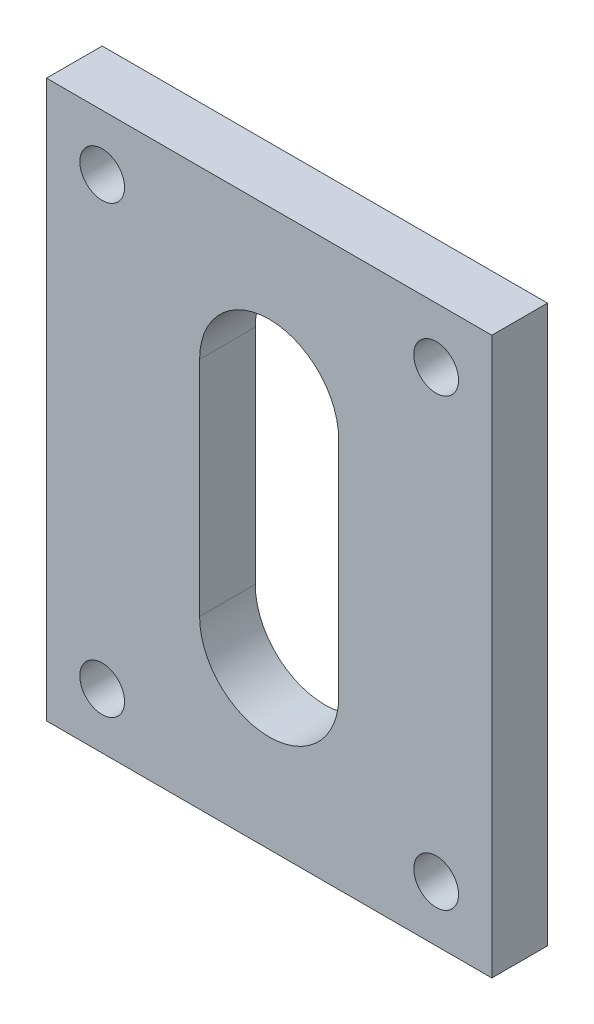
ISO-10303-21;
HEADER;
FILE_DESCRIPTION(('STEP AP214'),'2;1');
FILE_NAME('part.step','',(''),(''),'','','');
FILE_SCHEMA(('AUTOMOTIVE_DESIGN { 1 0 10303 214 1 1 1 1 }'));
ENDSEC;
DATA;
#1=APPLICATION_CONTEXT('core data for automotive mechanical design processes');
#2=APPLICATION_PROTOCOL_DEFINITION('international standard','automotive_design',2000,#1);
#3=PRODUCT_CONTEXT('',#1,'mechanical');
#4=PRODUCT('Part','Part','',(#3));
#5=PRODUCT_RELATED_PRODUCT_CATEGORY('part','',(#4));
#6=PRODUCT_DEFINITION_FORMATION('','',#4);
#7=PRODUCT_DEFINITION_CONTEXT('part definition',#1,'design');
#8=PRODUCT_DEFINITION('design','',#6,#7);
#9=PRODUCT_DEFINITION_SHAPE('','',#8);
#10=(LENGTH_UNIT() NAMED_UNIT(*) SI_UNIT(.MILLI.,.METRE.));
#11=(NAMED_UNIT(*) PLANE_ANGLE_UNIT() SI_UNIT($,.RADIAN.));
#12=(NAMED_UNIT(*) SI_UNIT($,.STERADIAN.) SOLID_ANGLE_UNIT());
#13=UNCERTAINTY_MEASURE_WITH_UNIT(LENGTH_MEASURE(1.E-05),#10,'distance_accuracy_value','');
#14=(GEOMETRIC_REPRESENTATION_CONTEXT(3) GLOBAL_UNCERTAINTY_ASSIGNED_CONTEXT((#13)) GLOBAL_UNIT_ASSIGNED_CONTEXT((#10,
#11,#12)) REPRESENTATION_CONTEXT('',''));
#15=CARTESIAN_POINT('',(0.,0.,0.));
#16=DIRECTION('',(0.,0.,1.));
#17=DIRECTION('',(1.,0.,0.));
#18=AXIS2_PLACEMENT_3D('',#15,#16,#17);
#19=CARTESIAN_POINT('',(0.,0.,6.35));
#20=DIRECTION('',(0.,0.,-1.));
#21=DIRECTION('',(-1.,0.,0.));
#22=AXIS2_PLACEMENT_3D('',#19,#20,#21);
#23=PLANE('',#22);
#24=CARTESIAN_POINT('',(-19.05,-25.4,6.35));
#25=DIRECTION('',(0.,0.,1.));
#26=DIRECTION('',(-1.,0.,0.));
#27=AXIS2_PLACEMENT_3D('',#24,#25,#26);
#28=CIRCLE('',#27,2.5527);
#29=CARTESIAN_POINT('',(-21.6027,-25.4,6.35));
#30=VERTEX_POINT('',#29);
#31=EDGE_CURVE('E134',#30,#30,#28,.T.);
#32=ORIENTED_EDGE('',*,*,#31,.F.);
#33=EDGE_LOOP('',(#32));
#34=FACE_BOUND('',#33,.T.);
#35=CARTESIAN_POINT('',(19.05,25.4,6.35));
#36=DIRECTION('',(0.,0.,1.));
#37=DIRECTION('',(1.,0.,0.));
#38=AXIS2_PLACEMENT_3D('',#35,#36,#37);
#39=CIRCLE('',#38,2.5527);
#40=CARTESIAN_POINT('',(21.6027,25.4,6.35));
#41=VERTEX_POINT('',#40);
#42=EDGE_CURVE('E146',#41,#41,#39,.T.);
#43=ORIENTED_EDGE('',*,*,#42,.F.);
#44=EDGE_LOOP('',(#43));
#45=FACE_BOUND('',#44,.T.);
#46=DIRECTION('',(0.,1.,0.));
#47=VECTOR('',#46,1.);
#48=CARTESIAN_POINT('',(25.4,-31.75,6.35));
#49=LINE('',#48,#47);
#50=CARTESIAN_POINT('',(25.4,-31.75,6.35));
#51=VERTEX_POINT('',#50);
#52=CARTESIAN_POINT('',(25.4,31.75,6.35));
#53=VERTEX_POINT('',#52);
#54=EDGE_CURVE('E158',#51,#53,#49,.T.);
#55=ORIENTED_EDGE('',*,*,#54,.T.);
#56=DIRECTION('',(-1.,0.,0.));
#57=VECTOR('',#56,1.);
#58=CARTESIAN_POINT('',(-25.4,31.75,6.35));
#59=LINE('',#58,#57);
#60=CARTESIAN_POINT('',(-25.4,31.75,6.35));
#61=VERTEX_POINT('',#60);
#62=EDGE_CURVE('E161',#53,#61,#59,.T.);
#63=ORIENTED_EDGE('',*,*,#62,.T.);
#64=DIRECTION('',(0.,-1.,0.));
#65=VECTOR('',#64,1.);
#66=CARTESIAN_POINT('',(-25.4,-31.75,6.35));
#67=LINE('',#66,#65);
#68=CARTESIAN_POINT('',(-25.4,-31.75,6.35));
#69=VERTEX_POINT('',#68);
#70=EDGE_CURVE('E164',#61,#69,#67,.T.);
#71=ORIENTED_EDGE('',*,*,#70,.T.);
#72=DIRECTION('',(1.,0.,0.));
#73=VECTOR('',#72,1.);
#74=CARTESIAN_POINT('',(-25.4,-31.75,6.35));
#75=LINE('',#74,#73);
#76=EDGE_CURVE('E166',#69,#51,#75,.T.);
#77=ORIENTED_EDGE('',*,*,#76,.T.);
#78=EDGE_LOOP('',(#55,#63,#71,#77));
#79=FACE_BOUND('',#78,.T.);
#80=CARTESIAN_POINT('',(-19.05,25.4,6.35));
#81=DIRECTION('',(0.,0.,1.));
#82=DIRECTION('',(-1.,0.,0.));
#83=AXIS2_PLACEMENT_3D('',#80,#81,#82);
#84=CIRCLE('',#83,2.5527);
#85=CARTESIAN_POINT('',(-21.6027,25.4,6.35));
#86=VERTEX_POINT('',#85);
#87=EDGE_CURVE('E152',#86,#86,#84,.T.);
#88=ORIENTED_EDGE('',*,*,#87,.F.);
#89=EDGE_LOOP('',(#88));
#90=FACE_BOUND('',#89,.T.);
#91=CARTESIAN_POINT('',(19.05,-25.4,6.35));
#92=DIRECTION('',(0.,0.,1.));
#93=DIRECTION('',(1.,0.,0.));
#94=AXIS2_PLACEMENT_3D('',#91,#92,#93);
#95=CIRCLE('',#94,2.5527);
#96=CARTESIAN_POINT('',(21.6027,-25.4,6.35));
#97=VERTEX_POINT('',#96);
#98=EDGE_CURVE('E140',#97,#97,#95,.T.);
#99=ORIENTED_EDGE('',*,*,#98,.F.);
#100=EDGE_LOOP('',(#99));
#101=FACE_BOUND('',#100,.T.);
#102=CARTESIAN_POINT('',(0.,-12.7,6.35));
#103=DIRECTION('',(0.,0.,1.));
#104=DIRECTION('',(1.,0.,0.));
#105=AXIS2_PLACEMENT_3D('',#102,#103,#104);
#106=CIRCLE('',#105,7.9375);
#107=CARTESIAN_POINT('',(-7.9375,-12.7,6.35));
#108=VERTEX_POINT('',#107);
#109=CARTESIAN_POINT('',(7.9375,-12.7,6.35));
#110=VERTEX_POINT('',#109);
#111=EDGE_CURVE('E98',#108,#110,#106,.T.);
#112=ORIENTED_EDGE('',*,*,#111,.F.);
#113=DIRECTION('',(0.,-1.,0.));
#114=VECTOR('',#113,1.);
#115=CARTESIAN_POINT('',(-7.9375,-12.7,6.35));
#116=LINE('',#115,#114);
#117=CARTESIAN_POINT('',(-7.9375,12.7,6.35));
#118=VERTEX_POINT('',#117);
#119=EDGE_CURVE('E120',#118,#108,#116,.T.);
#120=ORIENTED_EDGE('',*,*,#119,.F.);
#121=CARTESIAN_POINT('',(0.,12.7,6.35));
#122=DIRECTION('',(0.,0.,1.));
#123=DIRECTION('',(1.,0.,0.));
#124=AXIS2_PLACEMENT_3D('',#121,#122,#123);
#125=CIRCLE('',#124,7.9375);
#126=CARTESIAN_POINT('',(7.93749999999999,12.7,6.35));
#127=VERTEX_POINT('',#126);
#128=EDGE_CURVE('E118',#127,#118,#125,.T.);
#129=ORIENTED_EDGE('',*,*,#128,.F.);
#130=DIRECTION('',(0.,1.,0.));
#131=VECTOR('',#130,1.);
#132=CARTESIAN_POINT('',(7.9375,-12.7,6.35));
#133=LINE('',#132,#131);
#134=EDGE_CURVE('E106',#110,#127,#133,.T.);
#135=ORIENTED_EDGE('',*,*,#134,.F.);
#136=EDGE_LOOP('',(#112,#120,#129,#135));
#137=FACE_BOUND('',#136,.T.);
#138=ADVANCED_FACE('F33',(#34,#45,#79,#90,#101,#137),#23,.F.);
#139=CARTESIAN_POINT('',(0.,0.,0.));
#140=DIRECTION('',(0.,0.,-1.));
#141=DIRECTION('',(-1.,0.,0.));
#142=AXIS2_PLACEMENT_3D('',#139,#140,#141);
#143=PLANE('',#142);
#144=CARTESIAN_POINT('',(-19.05,-25.4,0.));
#145=DIRECTION('',(0.,0.,1.));
#146=DIRECTION('',(-1.,0.,0.));
#147=AXIS2_PLACEMENT_3D('',#144,#145,#146);
#148=CIRCLE('',#147,2.5527);
#149=CARTESIAN_POINT('',(-21.6027,-25.4,0.));
#150=VERTEX_POINT('',#149);
#151=EDGE_CURVE('E114',#150,#150,#148,.T.);
#152=ORIENTED_EDGE('',*,*,#151,.T.);
#153=EDGE_LOOP('',(#152));
#154=FACE_BOUND('',#153,.T.);
#155=CARTESIAN_POINT('',(19.05,25.4,0.));
#156=DIRECTION('',(0.,0.,1.));
#157=DIRECTION('',(1.,0.,0.));
#158=AXIS2_PLACEMENT_3D('',#155,#156,#157);
#159=CIRCLE('',#158,2.5527);
#160=CARTESIAN_POINT('',(21.6027,25.4,0.));
#161=VERTEX_POINT('',#160);
#162=EDGE_CURVE('E143',#161,#161,#159,.T.);
#163=ORIENTED_EDGE('',*,*,#162,.T.);
#164=EDGE_LOOP('',(#163));
#165=FACE_BOUND('',#164,.T.);
#166=DIRECTION('',(0.,1.,0.));
#167=VECTOR('',#166,1.);
#168=CARTESIAN_POINT('',(25.4,-31.75,0.));
#169=LINE('',#168,#167);
#170=CARTESIAN_POINT('',(25.4,-31.75,0.));
#171=VERTEX_POINT('',#170);
#172=CARTESIAN_POINT('',(25.4,31.75,0.));
#173=VERTEX_POINT('',#172);
#174=EDGE_CURVE('E155',#171,#173,#169,.T.);
#175=ORIENTED_EDGE('',*,*,#174,.F.);
#176=DIRECTION('',(1.,0.,0.));
#177=VECTOR('',#176,1.);
#178=CARTESIAN_POINT('',(-25.4,-31.75,0.));
#179=LINE('',#178,#177);
#180=CARTESIAN_POINT('',(-25.4,-31.75,0.));
#181=VERTEX_POINT('',#180);
#182=EDGE_CURVE('E162',#181,#171,#179,.T.);
#183=ORIENTED_EDGE('',*,*,#182,.F.);
#184=DIRECTION('',(0.,-1.,0.));
#185=VECTOR('',#184,1.);
#186=CARTESIAN_POINT('',(-25.4,-31.75,0.));
#187=LINE('',#186,#185);
#188=CARTESIAN_POINT('',(-25.4,31.75,0.));
#189=VERTEX_POINT('',#188);
#190=EDGE_CURVE('E173',#189,#181,#187,.T.);
#191=ORIENTED_EDGE('',*,*,#190,.F.);
#192=DIRECTION('',(-1.,0.,0.));
#193=VECTOR('',#192,1.);
#194=CARTESIAN_POINT('',(-25.4,31.75,0.));
#195=LINE('',#194,#193);
#196=EDGE_CURVE('E171',#173,#189,#195,.T.);
#197=ORIENTED_EDGE('',*,*,#196,.F.);
#198=EDGE_LOOP('',(#175,#183,#191,#197));
#199=FACE_BOUND('',#198,.T.);
#200=CARTESIAN_POINT('',(-19.05,25.4,0.));
#201=DIRECTION('',(0.,0.,1.));
#202=DIRECTION('',(-1.,0.,0.));
#203=AXIS2_PLACEMENT_3D('',#200,#201,#202);
#204=CIRCLE('',#203,2.5527);
#205=CARTESIAN_POINT('',(-21.6027,25.4,0.));
#206=VERTEX_POINT('',#205);
#207=EDGE_CURVE('E149',#206,#206,#204,.T.);
#208=ORIENTED_EDGE('',*,*,#207,.T.);
#209=EDGE_LOOP('',(#208));
#210=FACE_BOUND('',#209,.T.);
#211=CARTESIAN_POINT('',(19.05,-25.4,0.));
#212=DIRECTION('',(0.,0.,1.));
#213=DIRECTION('',(1.,0.,0.));
#214=AXIS2_PLACEMENT_3D('',#211,#212,#213);
#215=CIRCLE('',#214,2.5527);
#216=CARTESIAN_POINT('',(21.6027,-25.4,0.));
#217=VERTEX_POINT('',#216);
#218=EDGE_CURVE('E137',#217,#217,#215,.T.);
#219=ORIENTED_EDGE('',*,*,#218,.T.);
#220=EDGE_LOOP('',(#219));
#221=FACE_BOUND('',#220,.T.);
#222=DIRECTION('',(0.,-1.,0.));
#223=VECTOR('',#222,1.);
#224=CARTESIAN_POINT('',(-7.9375,-12.7,0.));
#225=LINE('',#224,#223);
#226=CARTESIAN_POINT('',(-7.9375,12.7,0.));
#227=VERTEX_POINT('',#226);
#228=CARTESIAN_POINT('',(-7.9375,-12.7,0.));
#229=VERTEX_POINT('',#228);
#230=EDGE_CURVE('E107',#227,#229,#225,.T.);
#231=ORIENTED_EDGE('',*,*,#230,.T.);
#232=CARTESIAN_POINT('',(0.,-12.7,0.));
#233=DIRECTION('',(0.,0.,1.));
#234=DIRECTION('',(1.,0.,0.));
#235=AXIS2_PLACEMENT_3D('',#232,#233,#234);
#236=CIRCLE('',#235,7.9375);
#237=CARTESIAN_POINT('',(7.9375,-12.7,0.));
#238=VERTEX_POINT('',#237);
#239=EDGE_CURVE('E56',#229,#238,#236,.T.);
#240=ORIENTED_EDGE('',*,*,#239,.T.);
#241=DIRECTION('',(0.,1.,0.));
#242=VECTOR('',#241,1.);
#243=CARTESIAN_POINT('',(7.9375,-12.7,0.));
#244=LINE('',#243,#242);
#245=CARTESIAN_POINT('',(7.93749999999999,12.7,0.));
#246=VERTEX_POINT('',#245);
#247=EDGE_CURVE('E113',#238,#246,#244,.T.);
#248=ORIENTED_EDGE('',*,*,#247,.T.);
#249=CARTESIAN_POINT('',(0.,12.7,0.));
#250=DIRECTION('',(0.,0.,1.));
#251=DIRECTION('',(1.,0.,0.));
#252=AXIS2_PLACEMENT_3D('',#249,#250,#251);
#253=CIRCLE('',#252,7.9375);
#254=EDGE_CURVE('E126',#246,#227,#253,.T.);
#255=ORIENTED_EDGE('',*,*,#254,.T.);
#256=EDGE_LOOP('',(#231,#240,#248,#255));
#257=FACE_BOUND('',#256,.T.);
#258=ADVANCED_FACE('F191',(#154,#165,#199,#210,#221,#257),#143,.T.);
#259=CARTESIAN_POINT('',(25.4,-31.75,6.35));
#260=DIRECTION('',(-1.,0.,0.));
#261=DIRECTION('',(0.,0.,1.));
#262=AXIS2_PLACEMENT_3D('',#259,#260,#261);
#263=PLANE('',#262);
#264=ORIENTED_EDGE('',*,*,#174,.T.);
#265=DIRECTION('',(0.,0.,-1.));
#266=VECTOR('',#265,1.);
#267=CARTESIAN_POINT('',(25.4,31.75,6.35));
#268=LINE('',#267,#266);
#269=EDGE_CURVE('E11',#53,#173,#268,.T.);
#270=ORIENTED_EDGE('',*,*,#269,.F.);
#271=ORIENTED_EDGE('',*,*,#54,.F.);
#272=DIRECTION('',(0.,0.,-1.));
#273=VECTOR('',#272,1.);
#274=CARTESIAN_POINT('',(25.4,-31.75,6.35));
#275=LINE('',#274,#273);
#276=EDGE_CURVE('E168',#51,#171,#275,.T.);
#277=ORIENTED_EDGE('',*,*,#276,.T.);
#278=EDGE_LOOP('',(#264,#270,#271,#277));
#279=FACE_BOUND('',#278,.T.);
#280=ADVANCED_FACE('F35',(#279),#263,.F.);
#281=CARTESIAN_POINT('',(-25.4,31.75,6.35));
#282=DIRECTION('',(0.,-1.,0.));
#283=DIRECTION('',(0.,0.,-1.));
#284=AXIS2_PLACEMENT_3D('',#281,#282,#283);
#285=PLANE('',#284);
#286=ORIENTED_EDGE('',*,*,#196,.T.);
#287=DIRECTION('',(0.,0.,-1.));
#288=VECTOR('',#287,1.);
#289=CARTESIAN_POINT('',(-25.4,31.75,6.35));
#290=LINE('',#289,#288);
#291=EDGE_CURVE('E41',#61,#189,#290,.T.);
#292=ORIENTED_EDGE('',*,*,#291,.F.);
#293=ORIENTED_EDGE('',*,*,#62,.F.);
#294=ORIENTED_EDGE('',*,*,#269,.T.);
#295=EDGE_LOOP('',(#286,#292,#293,#294));
#296=FACE_BOUND('',#295,.T.);
#297=ADVANCED_FACE('F202',(#296),#285,.F.);
#298=CARTESIAN_POINT('',(-25.4,-31.75,6.35));
#299=DIRECTION('',(1.,0.,0.));
#300=DIRECTION('',(0.,0.,-1.));
#301=AXIS2_PLACEMENT_3D('',#298,#299,#300);
#302=PLANE('',#301);
#303=ORIENTED_EDGE('',*,*,#190,.T.);
#304=DIRECTION('',(0.,0.,-1.));
#305=VECTOR('',#304,1.);
#306=CARTESIAN_POINT('',(-25.4,-31.75,6.35));
#307=LINE('',#306,#305);
#308=EDGE_CURVE('E178',#69,#181,#307,.T.);
#309=ORIENTED_EDGE('',*,*,#308,.F.);
#310=ORIENTED_EDGE('',*,*,#70,.F.);
#311=ORIENTED_EDGE('',*,*,#291,.T.);
#312=EDGE_LOOP('',(#303,#309,#310,#311));
#313=FACE_BOUND('',#312,.T.);
#314=ADVANCED_FACE('F185',(#313),#302,.F.);
#315=CARTESIAN_POINT('',(-25.4,-31.75,6.35));
#316=DIRECTION('',(0.,1.,0.));
#317=DIRECTION('',(0.,0.,1.));
#318=AXIS2_PLACEMENT_3D('',#315,#316,#317);
#319=PLANE('',#318);
#320=ORIENTED_EDGE('',*,*,#182,.T.);
#321=ORIENTED_EDGE('',*,*,#276,.F.);
#322=ORIENTED_EDGE('',*,*,#76,.F.);
#323=ORIENTED_EDGE('',*,*,#308,.T.);
#324=EDGE_LOOP('',(#320,#321,#322,#323));
#325=FACE_BOUND('',#324,.T.);
#326=ADVANCED_FACE('F195',(#325),#319,.F.);
#327=CARTESIAN_POINT('',(-19.05,25.4,6.35));
#328=DIRECTION('',(0.,0.,-1.));
#329=DIRECTION('',(-1.,0.,0.));
#330=AXIS2_PLACEMENT_3D('',#327,#328,#329);
#331=CYLINDRICAL_SURFACE('',#330,2.5527);
#332=ORIENTED_EDGE('',*,*,#87,.T.);
#333=EDGE_LOOP('',(#332));
#334=FACE_BOUND('',#333,.T.);
#335=ORIENTED_EDGE('',*,*,#207,.F.);
#336=EDGE_LOOP('',(#335));
#337=FACE_BOUND('',#336,.T.);
#338=ADVANCED_FACE('F220',(#334,#337),#331,.F.);
#339=CARTESIAN_POINT('',(19.05,25.4,6.35));
#340=DIRECTION('',(0.,0.,-1.));
#341=DIRECTION('',(-1.,0.,0.));
#342=AXIS2_PLACEMENT_3D('',#339,#340,#341);
#343=CYLINDRICAL_SURFACE('',#342,2.5527);
#344=ORIENTED_EDGE('',*,*,#42,.T.);
#345=EDGE_LOOP('',(#344));
#346=FACE_BOUND('',#345,.T.);
#347=ORIENTED_EDGE('',*,*,#162,.F.);
#348=EDGE_LOOP('',(#347));
#349=FACE_BOUND('',#348,.T.);
#350=ADVANCED_FACE('F227',(#346,#349),#343,.F.);
#351=CARTESIAN_POINT('',(19.05,-25.4,6.35));
#352=DIRECTION('',(0.,0.,-1.));
#353=DIRECTION('',(-1.,0.,0.));
#354=AXIS2_PLACEMENT_3D('',#351,#352,#353);
#355=CYLINDRICAL_SURFACE('',#354,2.5527);
#356=ORIENTED_EDGE('',*,*,#98,.T.);
#357=EDGE_LOOP('',(#356));
#358=FACE_BOUND('',#357,.T.);
#359=ORIENTED_EDGE('',*,*,#218,.F.);
#360=EDGE_LOOP('',(#359));
#361=FACE_BOUND('',#360,.T.);
#362=ADVANCED_FACE('F232',(#358,#361),#355,.F.);
#363=CARTESIAN_POINT('',(-19.05,-25.4,6.35));
#364=DIRECTION('',(0.,0.,-1.));
#365=DIRECTION('',(-1.,0.,0.));
#366=AXIS2_PLACEMENT_3D('',#363,#364,#365);
#367=CYLINDRICAL_SURFACE('',#366,2.5527);
#368=ORIENTED_EDGE('',*,*,#31,.T.);
#369=EDGE_LOOP('',(#368));
#370=FACE_BOUND('',#369,.T.);
#371=ORIENTED_EDGE('',*,*,#151,.F.);
#372=EDGE_LOOP('',(#371));
#373=FACE_BOUND('',#372,.T.);
#374=ADVANCED_FACE('F255',(#370,#373),#367,.F.);
#375=CARTESIAN_POINT('',(0.,-12.7,6.35));
#376=DIRECTION('',(0.,0.,-1.));
#377=DIRECTION('',(-1.,0.,0.));
#378=AXIS2_PLACEMENT_3D('',#375,#376,#377);
#379=CYLINDRICAL_SURFACE('',#378,7.9375);
#380=ORIENTED_EDGE('',*,*,#239,.F.);
#381=DIRECTION('',(0.,0.,-1.));
#382=VECTOR('',#381,1.);
#383=CARTESIAN_POINT('',(-7.9375,-12.7,6.35));
#384=LINE('',#383,#382);
#385=EDGE_CURVE('E102',#108,#229,#384,.T.);
#386=ORIENTED_EDGE('',*,*,#385,.F.);
#387=ORIENTED_EDGE('',*,*,#111,.T.);
#388=DIRECTION('',(0.,0.,-1.));
#389=VECTOR('',#388,1.);
#390=CARTESIAN_POINT('',(7.9375,-12.7,6.35));
#391=LINE('',#390,#389);
#392=EDGE_CURVE('E101',#110,#238,#391,.T.);
#393=ORIENTED_EDGE('',*,*,#392,.T.);
#394=EDGE_LOOP('',(#380,#386,#387,#393));
#395=FACE_BOUND('',#394,.T.);
#396=ADVANCED_FACE('F100',(#395),#379,.F.);
#397=CARTESIAN_POINT('',(7.9375,-12.7,6.35));
#398=DIRECTION('',(-1.,0.,0.));
#399=DIRECTION('',(0.,-1.,0.));
#400=AXIS2_PLACEMENT_3D('',#397,#398,#399);
#401=PLANE('',#400);
#402=ORIENTED_EDGE('',*,*,#247,.F.);
#403=ORIENTED_EDGE('',*,*,#392,.F.);
#404=ORIENTED_EDGE('',*,*,#134,.T.);
#405=DIRECTION('',(0.,0.,-1.));
#406=VECTOR('',#405,1.);
#407=CARTESIAN_POINT('',(7.93749999999999,12.7,6.35));
#408=LINE('',#407,#406);
#409=EDGE_CURVE('E115',#127,#246,#408,.T.);
#410=ORIENTED_EDGE('',*,*,#409,.T.);
#411=EDGE_LOOP('',(#402,#403,#404,#410));
#412=FACE_BOUND('',#411,.T.);
#413=ADVANCED_FACE('F110',(#412),#401,.T.);
#414=CARTESIAN_POINT('',(0.,12.7,6.35));
#415=DIRECTION('',(0.,0.,-1.));
#416=DIRECTION('',(-1.,0.,0.));
#417=AXIS2_PLACEMENT_3D('',#414,#415,#416);
#418=CYLINDRICAL_SURFACE('',#417,7.9375);
#419=ORIENTED_EDGE('',*,*,#254,.F.);
#420=ORIENTED_EDGE('',*,*,#409,.F.);
#421=ORIENTED_EDGE('',*,*,#128,.T.);
#422=DIRECTION('',(0.,0.,-1.));
#423=VECTOR('',#422,1.);
#424=CARTESIAN_POINT('',(-7.9375,12.7,6.35));
#425=LINE('',#424,#423);
#426=EDGE_CURVE('E48',#118,#227,#425,.T.);
#427=ORIENTED_EDGE('',*,*,#426,.T.);
#428=EDGE_LOOP('',(#419,#420,#421,#427));
#429=FACE_BOUND('',#428,.T.);
#430=ADVANCED_FACE('F243',(#429),#418,.F.);
#431=CARTESIAN_POINT('',(-7.9375,-12.7,6.35));
#432=DIRECTION('',(1.,0.,0.));
#433=DIRECTION('',(0.,1.,0.));
#434=AXIS2_PLACEMENT_3D('',#431,#432,#433);
#435=PLANE('',#434);
#436=ORIENTED_EDGE('',*,*,#230,.F.);
#437=ORIENTED_EDGE('',*,*,#426,.F.);
#438=ORIENTED_EDGE('',*,*,#119,.T.);
#439=ORIENTED_EDGE('',*,*,#385,.T.);
#440=EDGE_LOOP('',(#436,#437,#438,#439));
#441=FACE_BOUND('',#440,.T.);
#442=ADVANCED_FACE('F241',(#441),#435,.T.);
#443=CLOSED_SHELL('',(#138,#258,#280,#297,#314,#326,#338,#350,#362,#374,#396,#413,#430,#442));
#444=MANIFOLD_SOLID_BREP('B2',#443);
#445=ADVANCED_BREP_SHAPE_REPRESENTATION('',(#18,#444),#14);
#446=SHAPE_DEFINITION_REPRESENTATION(#9,#445);
ENDSEC;
END-ISO-10303-21;
